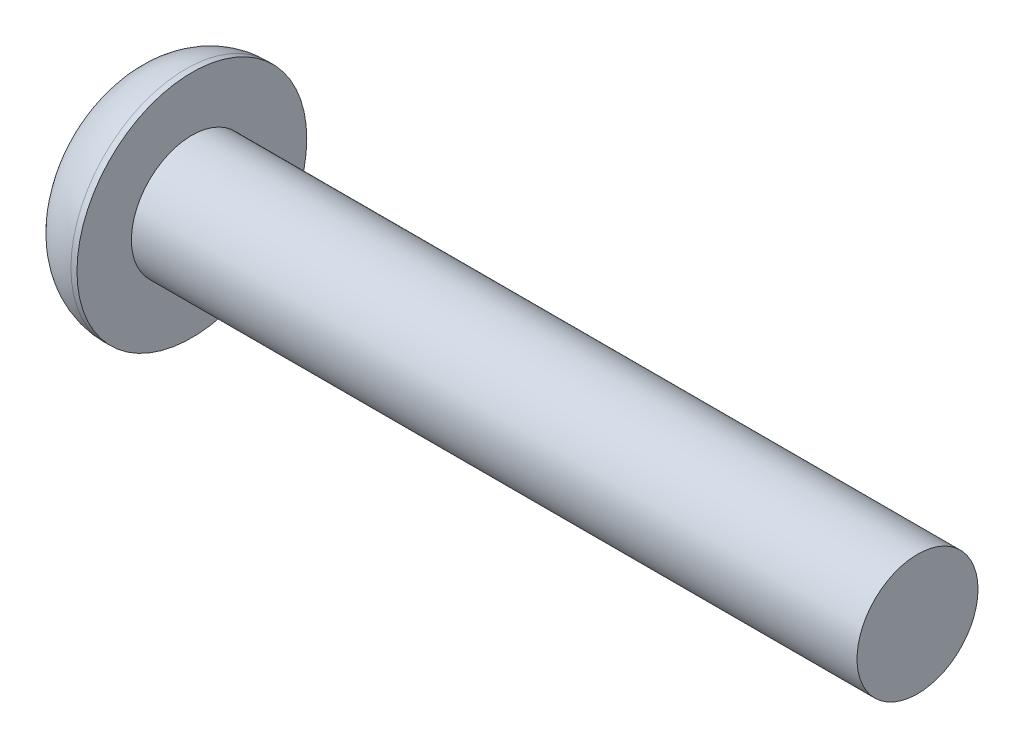
ISO-10303-21;
HEADER;
FILE_DESCRIPTION(('STEP AP214'),'2;1');
FILE_NAME('part.step','',(''),(''),'','','');
FILE_SCHEMA(('AUTOMOTIVE_DESIGN { 1 0 10303 214 1 1 1 1 }'));
ENDSEC;
DATA;
#1=APPLICATION_CONTEXT('core data for automotive mechanical design processes');
#2=APPLICATION_PROTOCOL_DEFINITION('international standard','automotive_design',2000,#1);
#3=PRODUCT_CONTEXT('',#1,'mechanical');
#4=PRODUCT('Part','Part','',(#3));
#5=PRODUCT_RELATED_PRODUCT_CATEGORY('part','',(#4));
#6=PRODUCT_DEFINITION_FORMATION('','',#4);
#7=PRODUCT_DEFINITION_CONTEXT('part definition',#1,'design');
#8=PRODUCT_DEFINITION('design','',#6,#7);
#9=PRODUCT_DEFINITION_SHAPE('','',#8);
#10=(LENGTH_UNIT() NAMED_UNIT(*) SI_UNIT(.MILLI.,.METRE.));
#11=(NAMED_UNIT(*) PLANE_ANGLE_UNIT() SI_UNIT($,.RADIAN.));
#12=(NAMED_UNIT(*) SI_UNIT($,.STERADIAN.) SOLID_ANGLE_UNIT());
#13=UNCERTAINTY_MEASURE_WITH_UNIT(LENGTH_MEASURE(1.E-05),#10,'distance_accuracy_value','');
#14=(GEOMETRIC_REPRESENTATION_CONTEXT(3) GLOBAL_UNCERTAINTY_ASSIGNED_CONTEXT((#13)) GLOBAL_UNIT_ASSIGNED_CONTEXT((#10,
#11,#12)) REPRESENTATION_CONTEXT('',''));
#15=CARTESIAN_POINT('',(0.,0.,0.));
#16=DIRECTION('',(0.,0.,1.));
#17=DIRECTION('',(1.,0.,0.));
#18=AXIS2_PLACEMENT_3D('',#15,#16,#17);
#19=CARTESIAN_POINT('',(0.,0.,-1.34999999999999));
#20=DIRECTION('',(-1.,0.,0.));
#21=DIRECTION('',(0.,0.,1.));
#22=AXIS2_PLACEMENT_3D('',#19,#20,#21);
#23=PLANE('',#22);
#24=DIRECTION('',(0.,0.866025403784439,0.5));
#25=VECTOR('',#24,1.);
#26=CARTESIAN_POINT('',(0.,-1.,0.577350269189626));
#27=LINE('',#26,#25);
#28=CARTESIAN_POINT('',(0.,-1.,0.577350269189626));
#29=VERTEX_POINT('',#28);
#30=CARTESIAN_POINT('',(0.,0.,1.15470053837925));
#31=VERTEX_POINT('',#30);
#32=EDGE_CURVE('E47',#29,#31,#27,.T.);
#33=ORIENTED_EDGE('',*,*,#32,.F.);
#34=DIRECTION('',(0.,0.,1.));
#35=VECTOR('',#34,1.);
#36=CARTESIAN_POINT('',(0.,-1.,-0.577350269189626));
#37=LINE('',#36,#35);
#38=CARTESIAN_POINT('',(0.,-1.,-0.577350269189626));
#39=VERTEX_POINT('',#38);
#40=EDGE_CURVE('E130',#39,#29,#37,.T.);
#41=ORIENTED_EDGE('',*,*,#40,.F.);
#42=DIRECTION('',(0.,-0.866025403784439,0.5));
#43=VECTOR('',#42,1.);
#44=CARTESIAN_POINT('',(0.,0.,-1.15470053837925));
#45=LINE('',#44,#43);
#46=CARTESIAN_POINT('',(0.,0.,-1.15470053837925));
#47=VERTEX_POINT('',#46);
#48=EDGE_CURVE('E128',#47,#39,#45,.T.);
#49=ORIENTED_EDGE('',*,*,#48,.F.);
#50=DIRECTION('',(0.,-0.866025403784439,-0.5));
#51=VECTOR('',#50,1.);
#52=CARTESIAN_POINT('',(0.,1.,-0.577350269189626));
#53=LINE('',#52,#51);
#54=CARTESIAN_POINT('',(0.,1.,-0.577350269189626));
#55=VERTEX_POINT('',#54);
#56=EDGE_CURVE('E95',#55,#47,#53,.T.);
#57=ORIENTED_EDGE('',*,*,#56,.F.);
#58=DIRECTION('',(0.,0.,-1.));
#59=VECTOR('',#58,1.);
#60=CARTESIAN_POINT('',(0.,1.,0.577350269189625));
#61=LINE('',#60,#59);
#62=CARTESIAN_POINT('',(0.,1.,0.577350269189625));
#63=VERTEX_POINT('',#62);
#64=EDGE_CURVE('E124',#63,#55,#61,.T.);
#65=ORIENTED_EDGE('',*,*,#64,.F.);
#66=DIRECTION('',(0.,0.866025403784439,-0.5));
#67=VECTOR('',#66,1.);
#68=CARTESIAN_POINT('',(0.,0.,1.15470053837925));
#69=LINE('',#68,#67);
#70=EDGE_CURVE('E121',#31,#63,#69,.T.);
#71=ORIENTED_EDGE('',*,*,#70,.F.);
#72=EDGE_LOOP('',(#33,#41,#49,#57,#65,#71));
#73=FACE_BOUND('',#72,.T.);
#74=CARTESIAN_POINT('',(0.,0.,0.));
#75=DIRECTION('',(1.,0.,0.));
#76=DIRECTION('',(0.,0.,-1.));
#77=AXIS2_PLACEMENT_3D('',#74,#75,#76);
#78=CIRCLE('',#77,1.34999999999999);
#79=CARTESIAN_POINT('',(0.,0.,-1.34999999999999));
#80=VERTEX_POINT('',#79);
#81=EDGE_CURVE('E11',#80,#80,#78,.T.);
#82=ORIENTED_EDGE('',*,*,#81,.F.);
#83=EDGE_LOOP('',(#82));
#84=FACE_BOUND('',#83,.T.);
#85=ADVANCED_FACE('F33',(#73,#84),#23,.T.);
#86=CARTESIAN_POINT('',(1.5,0.,0.));
#87=DIRECTION('',(1.,0.,0.));
#88=DIRECTION('',(0.,0.,-1.));
#89=AXIS2_PLACEMENT_3D('',#86,#87,#88);
#90=DEGENERATE_TOROIDAL_SURFACE('',#89,1.35,1.5,.T.);
#91=ORIENTED_EDGE('',*,*,#81,.T.);
#92=EDGE_LOOP('',(#91));
#93=FACE_BOUND('',#92,.T.);
#94=CARTESIAN_POINT('',(1.50000000000001,0.,0.));
#95=DIRECTION('',(1.,0.,0.));
#96=DIRECTION('',(0.,0.,-1.));
#97=AXIS2_PLACEMENT_3D('',#94,#95,#96);
#98=CIRCLE('',#97,2.85);
#99=CARTESIAN_POINT('',(1.50000000000001,0.,-2.85));
#100=VERTEX_POINT('',#99);
#101=EDGE_CURVE('E40',#100,#100,#98,.T.);
#102=ORIENTED_EDGE('',*,*,#101,.F.);
#103=EDGE_LOOP('',(#102));
#104=FACE_BOUND('',#103,.T.);
#105=ADVANCED_FACE('F153',(#93,#104),#90,.T.);
#106=CARTESIAN_POINT('',(0.,0.,0.));
#107=DIRECTION('',(1.,0.,0.));
#108=DIRECTION('',(0.,0.,-1.));
#109=AXIS2_PLACEMENT_3D('',#106,#107,#108);
#110=CYLINDRICAL_SURFACE('',#109,2.85);
#111=ORIENTED_EDGE('',*,*,#101,.T.);
#112=EDGE_LOOP('',(#111));
#113=FACE_BOUND('',#112,.T.);
#114=CARTESIAN_POINT('',(1.65,0.,0.));
#115=DIRECTION('',(1.,0.,0.));
#116=DIRECTION('',(0.,0.,-1.));
#117=AXIS2_PLACEMENT_3D('',#114,#115,#116);
#118=CIRCLE('',#117,2.85);
#119=CARTESIAN_POINT('',(1.65,0.,-2.85));
#120=VERTEX_POINT('',#119);
#121=EDGE_CURVE('E145',#120,#120,#118,.T.);
#122=ORIENTED_EDGE('',*,*,#121,.F.);
#123=EDGE_LOOP('',(#122));
#124=FACE_BOUND('',#123,.T.);
#125=ADVANCED_FACE('F150',(#113,#124),#110,.T.);
#126=CARTESIAN_POINT('',(1.65,0.,-1.5));
#127=DIRECTION('',(1.,0.,0.));
#128=DIRECTION('',(0.,0.,-1.));
#129=AXIS2_PLACEMENT_3D('',#126,#127,#128);
#130=PLANE('',#129);
#131=ORIENTED_EDGE('',*,*,#121,.T.);
#132=EDGE_LOOP('',(#131));
#133=FACE_BOUND('',#132,.T.);
#134=CARTESIAN_POINT('',(1.65,0.,0.));
#135=DIRECTION('',(1.,0.,0.));
#136=DIRECTION('',(0.,0.,-1.));
#137=AXIS2_PLACEMENT_3D('',#134,#135,#136);
#138=CIRCLE('',#137,1.5);
#139=CARTESIAN_POINT('',(1.65,0.,-1.5));
#140=VERTEX_POINT('',#139);
#141=EDGE_CURVE('E142',#140,#140,#138,.T.);
#142=ORIENTED_EDGE('',*,*,#141,.F.);
#143=EDGE_LOOP('',(#142));
#144=FACE_BOUND('',#143,.T.);
#145=ADVANCED_FACE('F160',(#133,#144),#130,.T.);
#146=CARTESIAN_POINT('',(0.,0.,0.));
#147=DIRECTION('',(1.,0.,0.));
#148=DIRECTION('',(0.,0.,-1.));
#149=AXIS2_PLACEMENT_3D('',#146,#147,#148);
#150=CYLINDRICAL_SURFACE('',#149,1.5);
#151=ORIENTED_EDGE('',*,*,#141,.T.);
#152=EDGE_LOOP('',(#151));
#153=FACE_BOUND('',#152,.T.);
#154=CARTESIAN_POINT('',(19.65,0.,0.));
#155=DIRECTION('',(1.,0.,0.));
#156=DIRECTION('',(0.,0.,-1.));
#157=AXIS2_PLACEMENT_3D('',#154,#155,#156);
#158=CIRCLE('',#157,1.5);
#159=CARTESIAN_POINT('',(19.65,0.,-1.5));
#160=VERTEX_POINT('',#159);
#161=EDGE_CURVE('E134',#160,#160,#158,.T.);
#162=ORIENTED_EDGE('',*,*,#161,.F.);
#163=EDGE_LOOP('',(#162));
#164=FACE_BOUND('',#163,.T.);
#165=ADVANCED_FACE('F166',(#153,#164),#150,.T.);
#166=CARTESIAN_POINT('',(19.65,0.,0.));
#167=DIRECTION('',(1.,0.,0.));
#168=DIRECTION('',(0.,0.,-1.));
#169=AXIS2_PLACEMENT_3D('',#166,#167,#168);
#170=PLANE('',#169);
#171=ORIENTED_EDGE('',*,*,#161,.T.);
#172=EDGE_LOOP('',(#171));
#173=FACE_BOUND('',#172,.T.);
#174=ADVANCED_FACE('F170',(#173),#170,.T.);
#175=CARTESIAN_POINT('',(1.04,-1.,0.577350269189626));
#176=DIRECTION('',(0.,-0.5,0.866025403784439));
#177=DIRECTION('',(0.,-0.866025403784439,-0.5));
#178=AXIS2_PLACEMENT_3D('',#175,#176,#177);
#179=PLANE('',#178);
#180=ORIENTED_EDGE('',*,*,#32,.T.);
#181=DIRECTION('',(-1.,0.,0.));
#182=VECTOR('',#181,1.);
#183=CARTESIAN_POINT('',(1.04,0.,1.15470053837925));
#184=LINE('',#183,#182);
#185=CARTESIAN_POINT('',(1.04,0.,1.15470053837925));
#186=VERTEX_POINT('',#185);
#187=EDGE_CURVE('E77',#186,#31,#184,.T.);
#188=ORIENTED_EDGE('',*,*,#187,.F.);
#189=DIRECTION('',(0.,0.866025403784439,0.5));
#190=VECTOR('',#189,1.);
#191=CARTESIAN_POINT('',(1.04,-1.,0.577350269189626));
#192=LINE('',#191,#190);
#193=CARTESIAN_POINT('',(1.04,-1.,0.577350269189626));
#194=VERTEX_POINT('',#193);
#195=EDGE_CURVE('E132',#194,#186,#192,.T.);
#196=ORIENTED_EDGE('',*,*,#195,.F.);
#197=DIRECTION('',(-1.,0.,0.));
#198=VECTOR('',#197,1.);
#199=CARTESIAN_POINT('',(1.04,-1.,0.577350269189626));
#200=LINE('',#199,#198);
#201=EDGE_CURVE('E55',#194,#29,#200,.T.);
#202=ORIENTED_EDGE('',*,*,#201,.T.);
#203=EDGE_LOOP('',(#180,#188,#196,#202));
#204=FACE_BOUND('',#203,.T.);
#205=ADVANCED_FACE('F174',(#204),#179,.F.);
#206=CARTESIAN_POINT('',(1.04,-1.,-0.577350269189626));
#207=DIRECTION('',(0.,-1.,0.));
#208=DIRECTION('',(0.,0.,-1.));
#209=AXIS2_PLACEMENT_3D('',#206,#207,#208);
#210=PLANE('',#209);
#211=ORIENTED_EDGE('',*,*,#40,.T.);
#212=ORIENTED_EDGE('',*,*,#201,.F.);
#213=DIRECTION('',(0.,0.,1.));
#214=VECTOR('',#213,1.);
#215=CARTESIAN_POINT('',(1.04,-1.,-0.577350269189626));
#216=LINE('',#215,#214);
#217=CARTESIAN_POINT('',(1.04,-1.,-0.577350269189626));
#218=VERTEX_POINT('',#217);
#219=EDGE_CURVE('E107',#218,#194,#216,.T.);
#220=ORIENTED_EDGE('',*,*,#219,.F.);
#221=DIRECTION('',(-1.,0.,0.));
#222=VECTOR('',#221,1.);
#223=CARTESIAN_POINT('',(1.04,-1.,-0.577350269189626));
#224=LINE('',#223,#222);
#225=EDGE_CURVE('E99',#218,#39,#224,.T.);
#226=ORIENTED_EDGE('',*,*,#225,.T.);
#227=EDGE_LOOP('',(#211,#212,#220,#226));
#228=FACE_BOUND('',#227,.T.);
#229=ADVANCED_FACE('F178',(#228),#210,.F.);
#230=CARTESIAN_POINT('',(1.04,0.,-1.15470053837925));
#231=DIRECTION('',(0.,-0.5,-0.866025403784439));
#232=DIRECTION('',(0.,0.866025403784439,-0.5));
#233=AXIS2_PLACEMENT_3D('',#230,#231,#232);
#234=PLANE('',#233);
#235=ORIENTED_EDGE('',*,*,#48,.T.);
#236=ORIENTED_EDGE('',*,*,#225,.F.);
#237=DIRECTION('',(0.,-0.866025403784439,0.5));
#238=VECTOR('',#237,1.);
#239=CARTESIAN_POINT('',(1.04,0.,-1.15470053837925));
#240=LINE('',#239,#238);
#241=CARTESIAN_POINT('',(1.04,0.,-1.15470053837925));
#242=VERTEX_POINT('',#241);
#243=EDGE_CURVE('E103',#242,#218,#240,.T.);
#244=ORIENTED_EDGE('',*,*,#243,.F.);
#245=DIRECTION('',(-1.,0.,0.));
#246=VECTOR('',#245,1.);
#247=CARTESIAN_POINT('',(1.04,0.,-1.15470053837925));
#248=LINE('',#247,#246);
#249=EDGE_CURVE('E88',#242,#47,#248,.T.);
#250=ORIENTED_EDGE('',*,*,#249,.T.);
#251=EDGE_LOOP('',(#235,#236,#244,#250));
#252=FACE_BOUND('',#251,.T.);
#253=ADVANCED_FACE('F104',(#252),#234,.F.);
#254=CARTESIAN_POINT('',(1.04,1.,-0.577350269189626));
#255=DIRECTION('',(0.,0.5,-0.866025403784439));
#256=DIRECTION('',(0.,0.866025403784439,0.5));
#257=AXIS2_PLACEMENT_3D('',#254,#255,#256);
#258=PLANE('',#257);
#259=ORIENTED_EDGE('',*,*,#56,.T.);
#260=ORIENTED_EDGE('',*,*,#249,.F.);
#261=DIRECTION('',(0.,-0.866025403784439,-0.5));
#262=VECTOR('',#261,1.);
#263=CARTESIAN_POINT('',(1.04,1.,-0.577350269189626));
#264=LINE('',#263,#262);
#265=CARTESIAN_POINT('',(1.04,1.,-0.577350269189626));
#266=VERTEX_POINT('',#265);
#267=EDGE_CURVE('E92',#266,#242,#264,.T.);
#268=ORIENTED_EDGE('',*,*,#267,.F.);
#269=DIRECTION('',(-1.,0.,0.));
#270=VECTOR('',#269,1.);
#271=CARTESIAN_POINT('',(1.04,1.,-0.577350269189626));
#272=LINE('',#271,#270);
#273=EDGE_CURVE('E100',#266,#55,#272,.T.);
#274=ORIENTED_EDGE('',*,*,#273,.T.);
#275=EDGE_LOOP('',(#259,#260,#268,#274));
#276=FACE_BOUND('',#275,.T.);
#277=ADVANCED_FACE('F90',(#276),#258,.F.);
#278=CARTESIAN_POINT('',(1.04,1.,0.577350269189625));
#279=DIRECTION('',(0.,1.,0.));
#280=DIRECTION('',(0.,0.,1.));
#281=AXIS2_PLACEMENT_3D('',#278,#279,#280);
#282=PLANE('',#281);
#283=ORIENTED_EDGE('',*,*,#64,.T.);
#284=ORIENTED_EDGE('',*,*,#273,.F.);
#285=DIRECTION('',(0.,0.,-1.));
#286=VECTOR('',#285,1.);
#287=CARTESIAN_POINT('',(1.04,1.,0.577350269189625));
#288=LINE('',#287,#286);
#289=CARTESIAN_POINT('',(1.04,1.,0.577350269189625));
#290=VERTEX_POINT('',#289);
#291=EDGE_CURVE('E113',#290,#266,#288,.T.);
#292=ORIENTED_EDGE('',*,*,#291,.F.);
#293=DIRECTION('',(-1.,0.,0.));
#294=VECTOR('',#293,1.);
#295=CARTESIAN_POINT('',(1.04,1.,0.577350269189625));
#296=LINE('',#295,#294);
#297=EDGE_CURVE('E137',#290,#63,#296,.T.);
#298=ORIENTED_EDGE('',*,*,#297,.T.);
#299=EDGE_LOOP('',(#283,#284,#292,#298));
#300=FACE_BOUND('',#299,.T.);
#301=ADVANCED_FACE('F182',(#300),#282,.F.);
#302=CARTESIAN_POINT('',(1.04,0.,1.15470053837925));
#303=DIRECTION('',(0.,0.5,0.866025403784439));
#304=DIRECTION('',(0.,-0.866025403784439,0.5));
#305=AXIS2_PLACEMENT_3D('',#302,#303,#304);
#306=PLANE('',#305);
#307=ORIENTED_EDGE('',*,*,#70,.T.);
#308=ORIENTED_EDGE('',*,*,#297,.F.);
#309=DIRECTION('',(0.,0.866025403784439,-0.5));
#310=VECTOR('',#309,1.);
#311=CARTESIAN_POINT('',(1.04,0.,1.15470053837925));
#312=LINE('',#311,#310);
#313=EDGE_CURVE('E115',#186,#290,#312,.T.);
#314=ORIENTED_EDGE('',*,*,#313,.F.);
#315=ORIENTED_EDGE('',*,*,#187,.T.);
#316=EDGE_LOOP('',(#307,#308,#314,#315));
#317=FACE_BOUND('',#316,.T.);
#318=ADVANCED_FACE('F179',(#317),#306,.F.);
#319=CARTESIAN_POINT('',(1.04,0.,0.));
#320=DIRECTION('',(-1.,0.,0.));
#321=DIRECTION('',(0.,0.,1.));
#322=AXIS2_PLACEMENT_3D('',#319,#320,#321);
#323=PLANE('',#322);
#324=ORIENTED_EDGE('',*,*,#195,.T.);
#325=ORIENTED_EDGE('',*,*,#313,.T.);
#326=ORIENTED_EDGE('',*,*,#291,.T.);
#327=ORIENTED_EDGE('',*,*,#267,.T.);
#328=ORIENTED_EDGE('',*,*,#243,.T.);
#329=ORIENTED_EDGE('',*,*,#219,.T.);
#330=EDGE_LOOP('',(#324,#325,#326,#327,#328,#329));
#331=FACE_BOUND('',#330,.T.);
#332=ADVANCED_FACE('F110',(#331),#323,.T.);
#333=CLOSED_SHELL('',(#85,#105,#125,#145,#165,#174,#205,#229,#253,#277,#301,#318,#332));
#334=MANIFOLD_SOLID_BREP('B2',#333);
#335=ADVANCED_BREP_SHAPE_REPRESENTATION('',(#18,#334),#14);
#336=SHAPE_DEFINITION_REPRESENTATION(#9,#335);
ENDSEC;
END-ISO-10303-21;
